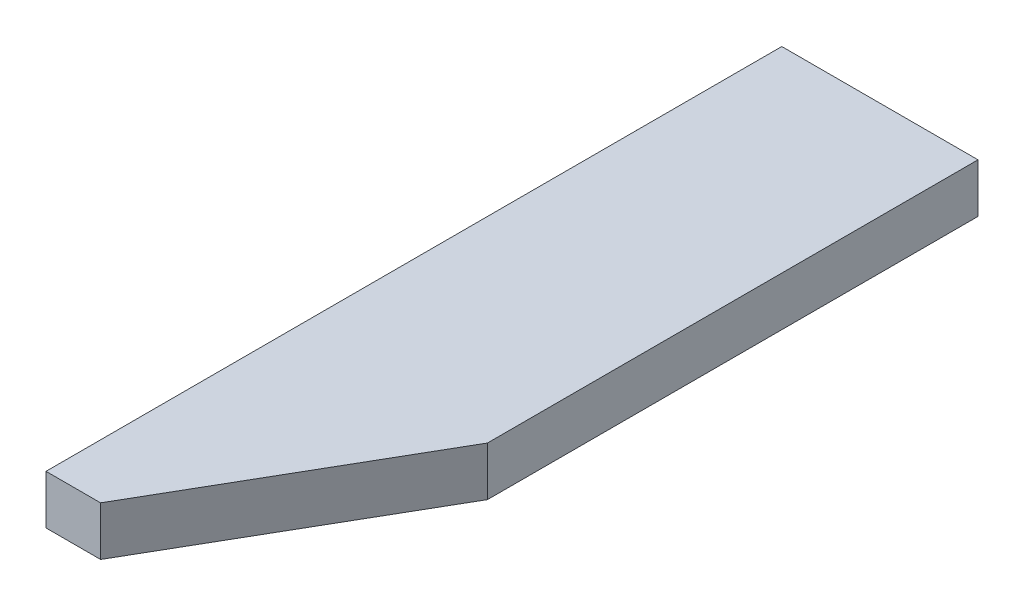
ISO-10303-21;
HEADER;
FILE_DESCRIPTION(('STEP AP214'),'2;1');
FILE_NAME('part.step','',(''),(''),'','','');
FILE_SCHEMA(('AUTOMOTIVE_DESIGN { 1 0 10303 214 1 1 1 1 }'));
ENDSEC;
DATA;
#1=APPLICATION_CONTEXT('core data for automotive mechanical design processes');
#2=APPLICATION_PROTOCOL_DEFINITION('international standard','automotive_design',2000,#1);
#3=PRODUCT_CONTEXT('',#1,'mechanical');
#4=PRODUCT('Part','Part','',(#3));
#5=PRODUCT_RELATED_PRODUCT_CATEGORY('part','',(#4));
#6=PRODUCT_DEFINITION_FORMATION('','',#4);
#7=PRODUCT_DEFINITION_CONTEXT('part definition',#1,'design');
#8=PRODUCT_DEFINITION('design','',#6,#7);
#9=PRODUCT_DEFINITION_SHAPE('','',#8);
#10=(LENGTH_UNIT() NAMED_UNIT(*) SI_UNIT(.MILLI.,.METRE.));
#11=(NAMED_UNIT(*) PLANE_ANGLE_UNIT() SI_UNIT($,.RADIAN.));
#12=(NAMED_UNIT(*) SI_UNIT($,.STERADIAN.) SOLID_ANGLE_UNIT());
#13=UNCERTAINTY_MEASURE_WITH_UNIT(LENGTH_MEASURE(1.E-05),#10,'distance_accuracy_value','');
#14=(GEOMETRIC_REPRESENTATION_CONTEXT(3) GLOBAL_UNCERTAINTY_ASSIGNED_CONTEXT((#13)) GLOBAL_UNIT_ASSIGNED_CONTEXT((#10,
#11,#12)) REPRESENTATION_CONTEXT('',''));
#15=CARTESIAN_POINT('',(0.,0.,0.));
#16=DIRECTION('',(0.,0.,1.));
#17=DIRECTION('',(1.,0.,0.));
#18=AXIS2_PLACEMENT_3D('',#15,#16,#17);
#19=CARTESIAN_POINT('',(0.,0.,150.));
#20=DIRECTION('',(1.,0.,0.));
#21=DIRECTION('',(0.,0.,-1.));
#22=AXIS2_PLACEMENT_3D('',#19,#20,#21);
#23=PLANE('',#22);
#24=DIRECTION('',(0.,-1.,0.));
#25=VECTOR('',#24,1.);
#26=CARTESIAN_POINT('',(0.,0.,0.));
#27=LINE('',#26,#25);
#28=CARTESIAN_POINT('',(0.,10.,0.));
#29=VERTEX_POINT('',#28);
#30=CARTESIAN_POINT('',(0.,0.,0.));
#31=VERTEX_POINT('',#30);
#32=EDGE_CURVE('E99',#29,#31,#27,.T.);
#33=ORIENTED_EDGE('',*,*,#32,.T.);
#34=DIRECTION('',(0.,0.,-1.));
#35=VECTOR('',#34,1.);
#36=CARTESIAN_POINT('',(0.,0.,150.));
#37=LINE('',#36,#35);
#38=CARTESIAN_POINT('',(0.,0.,150.));
#39=VERTEX_POINT('',#38);
#40=EDGE_CURVE('E11',#39,#31,#37,.T.);
#41=ORIENTED_EDGE('',*,*,#40,.F.);
#42=DIRECTION('',(0.,-1.,0.));
#43=VECTOR('',#42,1.);
#44=CARTESIAN_POINT('',(0.,0.,150.));
#45=LINE('',#44,#43);
#46=CARTESIAN_POINT('',(0.,10.,150.));
#47=VERTEX_POINT('',#46);
#48=EDGE_CURVE('E93',#47,#39,#45,.T.);
#49=ORIENTED_EDGE('',*,*,#48,.F.);
#50=DIRECTION('',(0.,0.,-1.));
#51=VECTOR('',#50,1.);
#52=CARTESIAN_POINT('',(0.,10.,150.));
#53=LINE('',#52,#51);
#54=EDGE_CURVE('E84',#47,#29,#53,.T.);
#55=ORIENTED_EDGE('',*,*,#54,.T.);
#56=EDGE_LOOP('',(#33,#41,#49,#55));
#57=FACE_BOUND('',#56,.T.);
#58=ADVANCED_FACE('F39',(#57),#23,.F.);
#59=CARTESIAN_POINT('',(0.,0.,150.));
#60=DIRECTION('',(0.,1.,0.));
#61=DIRECTION('',(0.,0.,1.));
#62=AXIS2_PLACEMENT_3D('',#59,#60,#61);
#63=PLANE('',#62);
#64=DIRECTION('',(0.,0.,-1.));
#65=VECTOR('',#64,1.);
#66=CARTESIAN_POINT('',(40.,0.,150.));
#67=LINE('',#66,#65);
#68=CARTESIAN_POINT('',(40.,0.,100.));
#69=VERTEX_POINT('',#68);
#70=CARTESIAN_POINT('',(40.,0.,0.));
#71=VERTEX_POINT('',#70);
#72=EDGE_CURVE('E47',#69,#71,#67,.T.);
#73=ORIENTED_EDGE('',*,*,#72,.F.);
#74=DIRECTION('',(-0.499999999999995,0.,0.866025403784442));
#75=VECTOR('',#74,1.);
#76=CARTESIAN_POINT('',(40.,0.,100.));
#77=LINE('',#76,#75);
#78=CARTESIAN_POINT('',(11.1324865405191,0.,150.));
#79=VERTEX_POINT('',#78);
#80=EDGE_CURVE('E131',#69,#79,#77,.T.);
#81=ORIENTED_EDGE('',*,*,#80,.T.);
#82=DIRECTION('',(1.,0.,0.));
#83=VECTOR('',#82,1.);
#84=CARTESIAN_POINT('',(0.,0.,150.));
#85=LINE('',#84,#83);
#86=EDGE_CURVE('E129',#39,#79,#85,.T.);
#87=ORIENTED_EDGE('',*,*,#86,.F.);
#88=ORIENTED_EDGE('',*,*,#40,.T.);
#89=DIRECTION('',(1.,0.,0.));
#90=VECTOR('',#89,1.);
#91=CARTESIAN_POINT('',(0.,0.,0.));
#92=LINE('',#91,#90);
#93=EDGE_CURVE('E104',#31,#71,#92,.T.);
#94=ORIENTED_EDGE('',*,*,#93,.T.);
#95=EDGE_LOOP('',(#73,#81,#87,#88,#94));
#96=FACE_BOUND('',#95,.T.);
#97=ADVANCED_FACE('F127',(#96),#63,.F.);
#98=CARTESIAN_POINT('',(40.,0.,150.));
#99=DIRECTION('',(-1.,0.,0.));
#100=DIRECTION('',(0.,0.,1.));
#101=AXIS2_PLACEMENT_3D('',#98,#99,#100);
#102=PLANE('',#101);
#103=DIRECTION('',(0.,0.,-1.));
#104=VECTOR('',#103,1.);
#105=CARTESIAN_POINT('',(40.,10.,150.));
#106=LINE('',#105,#104);
#107=CARTESIAN_POINT('',(40.,10.,100.));
#108=VERTEX_POINT('',#107);
#109=CARTESIAN_POINT('',(40.,10.,0.));
#110=VERTEX_POINT('',#109);
#111=EDGE_CURVE('E87',#108,#110,#106,.T.);
#112=ORIENTED_EDGE('',*,*,#111,.F.);
#113=DIRECTION('',(0.,1.,0.));
#114=VECTOR('',#113,1.);
#115=CARTESIAN_POINT('',(40.,0.,100.));
#116=LINE('',#115,#114);
#117=EDGE_CURVE('E111',#69,#108,#116,.T.);
#118=ORIENTED_EDGE('',*,*,#117,.F.);
#119=ORIENTED_EDGE('',*,*,#72,.T.);
#120=DIRECTION('',(0.,1.,0.));
#121=VECTOR('',#120,1.);
#122=CARTESIAN_POINT('',(40.,0.,0.));
#123=LINE('',#122,#121);
#124=EDGE_CURVE('E94',#71,#110,#123,.T.);
#125=ORIENTED_EDGE('',*,*,#124,.T.);
#126=EDGE_LOOP('',(#112,#118,#119,#125));
#127=FACE_BOUND('',#126,.T.);
#128=ADVANCED_FACE('F123',(#127),#102,.F.);
#129=CARTESIAN_POINT('',(0.,10.,150.));
#130=DIRECTION('',(0.,-1.,0.));
#131=DIRECTION('',(0.,0.,-1.));
#132=AXIS2_PLACEMENT_3D('',#129,#130,#131);
#133=PLANE('',#132);
#134=DIRECTION('',(-1.,0.,0.));
#135=VECTOR('',#134,1.);
#136=CARTESIAN_POINT('',(0.,10.,150.));
#137=LINE('',#136,#135);
#138=CARTESIAN_POINT('',(11.1324865405191,10.,150.));
#139=VERTEX_POINT('',#138);
#140=EDGE_CURVE('E62',#139,#47,#137,.T.);
#141=ORIENTED_EDGE('',*,*,#140,.F.);
#142=DIRECTION('',(-0.499999999999995,0.,0.866025403784442));
#143=VECTOR('',#142,1.);
#144=CARTESIAN_POINT('',(40.,10.,100.));
#145=LINE('',#144,#143);
#146=EDGE_CURVE('E54',#108,#139,#145,.T.);
#147=ORIENTED_EDGE('',*,*,#146,.F.);
#148=ORIENTED_EDGE('',*,*,#111,.T.);
#149=DIRECTION('',(-1.,0.,0.));
#150=VECTOR('',#149,1.);
#151=CARTESIAN_POINT('',(0.,10.,0.));
#152=LINE('',#151,#150);
#153=EDGE_CURVE('E81',#110,#29,#152,.T.);
#154=ORIENTED_EDGE('',*,*,#153,.T.);
#155=ORIENTED_EDGE('',*,*,#54,.F.);
#156=EDGE_LOOP('',(#141,#147,#148,#154,#155));
#157=FACE_BOUND('',#156,.T.);
#158=ADVANCED_FACE('F83',(#157),#133,.F.);
#159=CARTESIAN_POINT('',(0.,0.,150.));
#160=DIRECTION('',(0.,0.,-1.));
#161=DIRECTION('',(-1.,0.,0.));
#162=AXIS2_PLACEMENT_3D('',#159,#160,#161);
#163=PLANE('',#162);
#164=ORIENTED_EDGE('',*,*,#86,.T.);
#165=DIRECTION('',(0.,1.,0.));
#166=VECTOR('',#165,1.);
#167=CARTESIAN_POINT('',(11.1324865405191,0.,150.));
#168=LINE('',#167,#166);
#169=EDGE_CURVE('E106',#79,#139,#168,.T.);
#170=ORIENTED_EDGE('',*,*,#169,.T.);
#171=ORIENTED_EDGE('',*,*,#140,.T.);
#172=ORIENTED_EDGE('',*,*,#48,.T.);
#173=EDGE_LOOP('',(#164,#170,#171,#172));
#174=FACE_BOUND('',#173,.T.);
#175=ADVANCED_FACE('F133',(#174),#163,.F.);
#176=CARTESIAN_POINT('',(0.,0.,0.));
#177=DIRECTION('',(0.,0.,-1.));
#178=DIRECTION('',(-1.,0.,0.));
#179=AXIS2_PLACEMENT_3D('',#176,#177,#178);
#180=PLANE('',#179);
#181=ORIENTED_EDGE('',*,*,#32,.F.);
#182=ORIENTED_EDGE('',*,*,#153,.F.);
#183=ORIENTED_EDGE('',*,*,#124,.F.);
#184=ORIENTED_EDGE('',*,*,#93,.F.);
#185=EDGE_LOOP('',(#181,#182,#183,#184));
#186=FACE_BOUND('',#185,.T.);
#187=ADVANCED_FACE('F102',(#186),#180,.T.);
#188=CARTESIAN_POINT('',(40.,0.,100.));
#189=DIRECTION('',(-0.866025403784442,0.,-0.499999999999995));
#190=DIRECTION('',(-0.499999999999995,0.,0.866025403784442));
#191=AXIS2_PLACEMENT_3D('',#188,#189,#190);
#192=PLANE('',#191);
#193=ORIENTED_EDGE('',*,*,#146,.T.);
#194=ORIENTED_EDGE('',*,*,#169,.F.);
#195=ORIENTED_EDGE('',*,*,#80,.F.);
#196=ORIENTED_EDGE('',*,*,#117,.T.);
#197=EDGE_LOOP('',(#193,#194,#195,#196));
#198=FACE_BOUND('',#197,.T.);
#199=ADVANCED_FACE('F143',(#198),#192,.F.);
#200=CLOSED_SHELL('',(#58,#97,#128,#158,#175,#187,#199));
#201=MANIFOLD_SOLID_BREP('B2',#200);
#202=ADVANCED_BREP_SHAPE_REPRESENTATION('',(#18,#201),#14);
#203=SHAPE_DEFINITION_REPRESENTATION(#9,#202);
ENDSEC;
END-ISO-10303-21;
